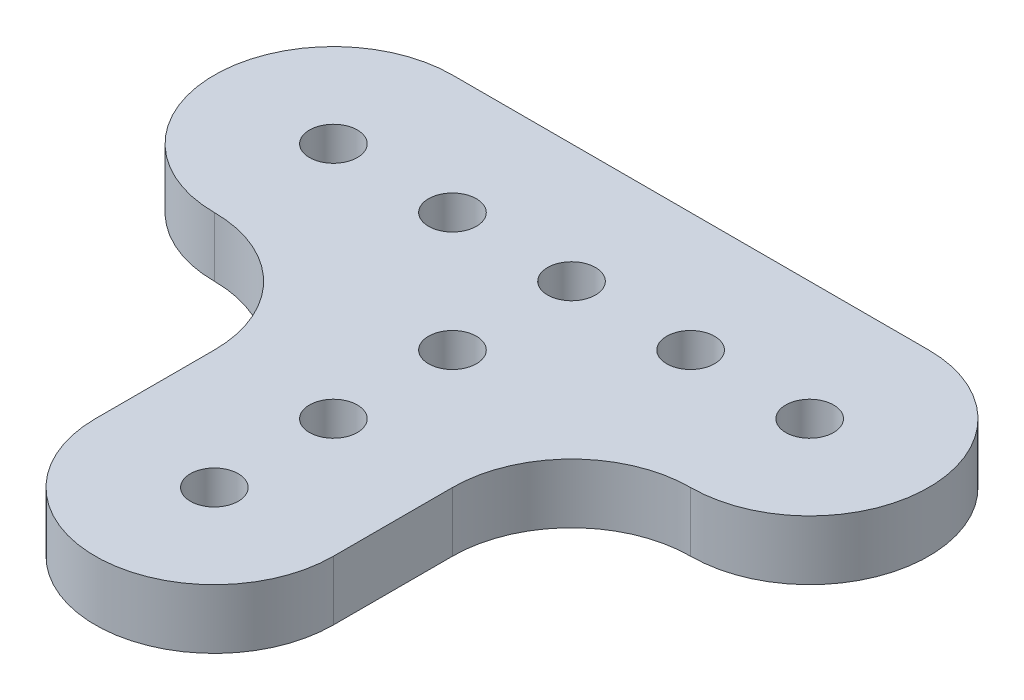
ISO-10303-21;
HEADER;
FILE_DESCRIPTION(('STEP AP214'),'2;1');
FILE_NAME('part.step','',(''),(''),'','','');
FILE_SCHEMA(('AUTOMOTIVE_DESIGN { 1 0 10303 214 1 1 1 1 }'));
ENDSEC;
DATA;
#1=APPLICATION_CONTEXT('core data for automotive mechanical design processes');
#2=APPLICATION_PROTOCOL_DEFINITION('international standard','automotive_design',2000,#1);
#3=PRODUCT_CONTEXT('',#1,'mechanical');
#4=PRODUCT('Part','Part','',(#3));
#5=PRODUCT_RELATED_PRODUCT_CATEGORY('part','',(#4));
#6=PRODUCT_DEFINITION_FORMATION('','',#4);
#7=PRODUCT_DEFINITION_CONTEXT('part definition',#1,'design');
#8=PRODUCT_DEFINITION('design','',#6,#7);
#9=PRODUCT_DEFINITION_SHAPE('','',#8);
#10=(LENGTH_UNIT() NAMED_UNIT(*) SI_UNIT(.MILLI.,.METRE.));
#11=(NAMED_UNIT(*) PLANE_ANGLE_UNIT() SI_UNIT($,.RADIAN.));
#12=(NAMED_UNIT(*) SI_UNIT($,.STERADIAN.) SOLID_ANGLE_UNIT());
#13=UNCERTAINTY_MEASURE_WITH_UNIT(LENGTH_MEASURE(1.E-05),#10,'distance_accuracy_value','');
#14=(GEOMETRIC_REPRESENTATION_CONTEXT(3) GLOBAL_UNCERTAINTY_ASSIGNED_CONTEXT((#13)) GLOBAL_UNIT_ASSIGNED_CONTEXT((#10,
#11,#12)) REPRESENTATION_CONTEXT('',''));
#15=CARTESIAN_POINT('',(0.,0.,0.));
#16=DIRECTION('',(0.,0.,1.));
#17=DIRECTION('',(1.,0.,0.));
#18=AXIS2_PLACEMENT_3D('',#15,#16,#17);
#19=CARTESIAN_POINT('',(50.8,3.175,0.));
#20=DIRECTION('',(0.,-1.,0.));
#21=DIRECTION('',(0.,0.,-1.));
#22=AXIS2_PLACEMENT_3D('',#19,#20,#21);
#23=CYLINDRICAL_SURFACE('',#22,12.7);
#24=CARTESIAN_POINT('',(50.8,-3.175,0.));
#25=DIRECTION('',(0.,1.,0.));
#26=DIRECTION('',(0.,0.,1.));
#27=AXIS2_PLACEMENT_3D('',#24,#25,#26);
#28=CIRCLE('',#27,12.7);
#29=CARTESIAN_POINT('',(50.8,-3.175,12.7));
#30=VERTEX_POINT('',#29);
#31=CARTESIAN_POINT('',(50.8,-3.175,-12.7));
#32=VERTEX_POINT('',#31);
#33=EDGE_CURVE('E115',#30,#32,#28,.T.);
#34=ORIENTED_EDGE('',*,*,#33,.T.);
#35=DIRECTION('',(0.,-1.,0.));
#36=VECTOR('',#35,1.);
#37=CARTESIAN_POINT('',(50.8,3.175,-12.7));
#38=LINE('',#37,#36);
#39=CARTESIAN_POINT('',(50.8,3.175,-12.7));
#40=VERTEX_POINT('',#39);
#41=EDGE_CURVE('E113',#40,#32,#38,.T.);
#42=ORIENTED_EDGE('',*,*,#41,.F.);
#43=CARTESIAN_POINT('',(50.8,3.175,0.));
#44=DIRECTION('',(0.,1.,0.));
#45=DIRECTION('',(0.,0.,1.));
#46=AXIS2_PLACEMENT_3D('',#43,#44,#45);
#47=CIRCLE('',#46,12.7);
#48=CARTESIAN_POINT('',(50.8,3.175,12.7));
#49=VERTEX_POINT('',#48);
#50=EDGE_CURVE('E98',#49,#40,#47,.T.);
#51=ORIENTED_EDGE('',*,*,#50,.F.);
#52=DIRECTION('',(0.,-1.,0.));
#53=VECTOR('',#52,1.);
#54=CARTESIAN_POINT('',(50.8,3.175,12.7));
#55=LINE('',#54,#53);
#56=EDGE_CURVE('E158',#49,#30,#55,.T.);
#57=ORIENTED_EDGE('',*,*,#56,.T.);
#58=EDGE_LOOP('',(#34,#42,#51,#57));
#59=FACE_BOUND('',#58,.T.);
#60=ADVANCED_FACE('F35',(#59),#23,.T.);
#61=CARTESIAN_POINT('',(0.,3.175,-12.7));
#62=DIRECTION('',(0.,0.,-1.));
#63=DIRECTION('',(-1.,0.,0.));
#64=AXIS2_PLACEMENT_3D('',#61,#62,#63);
#65=PLANE('',#64);
#66=DIRECTION('',(1.,0.,0.));
#67=VECTOR('',#66,1.);
#68=CARTESIAN_POINT('',(0.,-3.175,-12.7));
#69=LINE('',#68,#67);
#70=CARTESIAN_POINT('',(0.,-3.175,-12.7));
#71=VERTEX_POINT('',#70);
#72=EDGE_CURVE('E160',#71,#32,#69,.T.);
#73=ORIENTED_EDGE('',*,*,#72,.F.);
#74=DIRECTION('',(0.,-1.,0.));
#75=VECTOR('',#74,1.);
#76=CARTESIAN_POINT('',(0.,3.175,-12.7));
#77=LINE('',#76,#75);
#78=CARTESIAN_POINT('',(0.,3.175,-12.7));
#79=VERTEX_POINT('',#78);
#80=EDGE_CURVE('E120',#79,#71,#77,.T.);
#81=ORIENTED_EDGE('',*,*,#80,.F.);
#82=DIRECTION('',(1.,0.,0.));
#83=VECTOR('',#82,1.);
#84=CARTESIAN_POINT('',(0.,3.175,-12.7));
#85=LINE('',#84,#83);
#86=EDGE_CURVE('E103',#79,#40,#85,.T.);
#87=ORIENTED_EDGE('',*,*,#86,.T.);
#88=ORIENTED_EDGE('',*,*,#41,.T.);
#89=EDGE_LOOP('',(#73,#81,#87,#88));
#90=FACE_BOUND('',#89,.T.);
#91=ADVANCED_FACE('F122',(#90),#65,.T.);
#92=CARTESIAN_POINT('',(0.,3.175,0.));
#93=DIRECTION('',(0.,-1.,0.));
#94=DIRECTION('',(0.,0.,-1.));
#95=AXIS2_PLACEMENT_3D('',#92,#93,#94);
#96=CYLINDRICAL_SURFACE('',#95,12.7);
#97=CARTESIAN_POINT('',(0.,-3.175,0.));
#98=DIRECTION('',(0.,1.,0.));
#99=DIRECTION('',(0.,0.,1.));
#100=AXIS2_PLACEMENT_3D('',#97,#98,#99);
#101=CIRCLE('',#100,12.7);
#102=CARTESIAN_POINT('',(0.,-3.175,12.7));
#103=VERTEX_POINT('',#102);
#104=EDGE_CURVE('E162',#71,#103,#101,.T.);
#105=ORIENTED_EDGE('',*,*,#104,.T.);
#106=DIRECTION('',(0.,-1.,0.));
#107=VECTOR('',#106,1.);
#108=CARTESIAN_POINT('',(0.,3.175,12.7));
#109=LINE('',#108,#107);
#110=CARTESIAN_POINT('',(0.,3.175,12.7));
#111=VERTEX_POINT('',#110);
#112=EDGE_CURVE('E202',#111,#103,#109,.T.);
#113=ORIENTED_EDGE('',*,*,#112,.F.);
#114=CARTESIAN_POINT('',(0.,3.175,0.));
#115=DIRECTION('',(0.,1.,0.));
#116=DIRECTION('',(0.,0.,1.));
#117=AXIS2_PLACEMENT_3D('',#114,#115,#116);
#118=CIRCLE('',#117,12.7);
#119=EDGE_CURVE('E124',#79,#111,#118,.T.);
#120=ORIENTED_EDGE('',*,*,#119,.F.);
#121=ORIENTED_EDGE('',*,*,#80,.T.);
#122=EDGE_LOOP('',(#105,#113,#120,#121));
#123=FACE_BOUND('',#122,.T.);
#124=ADVANCED_FACE('F218',(#123),#96,.T.);
#125=CARTESIAN_POINT('',(12.7,3.175,0.));
#126=DIRECTION('',(-1.,0.,0.));
#127=DIRECTION('',(0.,0.,1.));
#128=AXIS2_PLACEMENT_3D('',#125,#126,#127);
#129=PLANE('',#128);
#130=DIRECTION('',(0.,0.,-1.));
#131=VECTOR('',#130,1.);
#132=CARTESIAN_POINT('',(12.7,3.175,0.));
#133=LINE('',#132,#131);
#134=CARTESIAN_POINT('',(12.7,3.175,38.1));
#135=VERTEX_POINT('',#134);
#136=CARTESIAN_POINT('',(12.7,3.175,25.4));
#137=VERTEX_POINT('',#136);
#138=EDGE_CURVE('E126',#135,#137,#133,.T.);
#139=ORIENTED_EDGE('',*,*,#138,.T.);
#140=DIRECTION('',(0.,-1.,0.));
#141=VECTOR('',#140,1.);
#142=CARTESIAN_POINT('',(12.7,3.175,25.4));
#143=LINE('',#142,#141);
#144=CARTESIAN_POINT('',(12.7,-3.175,25.4));
#145=VERTEX_POINT('',#144);
#146=EDGE_CURVE('E206',#137,#145,#143,.T.);
#147=ORIENTED_EDGE('',*,*,#146,.T.);
#148=DIRECTION('',(0.,0.,-1.));
#149=VECTOR('',#148,1.);
#150=CARTESIAN_POINT('',(12.7,-3.175,0.));
#151=LINE('',#150,#149);
#152=CARTESIAN_POINT('',(12.7,-3.175,38.1));
#153=VERTEX_POINT('',#152);
#154=EDGE_CURVE('E165',#153,#145,#151,.T.);
#155=ORIENTED_EDGE('',*,*,#154,.F.);
#156=DIRECTION('',(0.,-1.,0.));
#157=VECTOR('',#156,1.);
#158=CARTESIAN_POINT('',(12.7,3.175,38.1));
#159=LINE('',#158,#157);
#160=EDGE_CURVE('E200',#135,#153,#159,.T.);
#161=ORIENTED_EDGE('',*,*,#160,.F.);
#162=EDGE_LOOP('',(#139,#147,#155,#161));
#163=FACE_BOUND('',#162,.T.);
#164=ADVANCED_FACE('F220',(#163),#129,.T.);
#165=CARTESIAN_POINT('',(25.4000000000005,3.175,38.1));
#166=DIRECTION('',(0.,-1.,0.));
#167=DIRECTION('',(0.,0.,-1.));
#168=AXIS2_PLACEMENT_3D('',#165,#166,#167);
#169=CYLINDRICAL_SURFACE('',#168,12.7);
#170=CARTESIAN_POINT('',(25.4000000000005,-3.175,38.1));
#171=DIRECTION('',(0.,1.,0.));
#172=DIRECTION('',(0.,0.,1.));
#173=AXIS2_PLACEMENT_3D('',#170,#171,#172);
#174=CIRCLE('',#173,12.7);
#175=CARTESIAN_POINT('',(38.1,-3.175,38.1));
#176=VERTEX_POINT('',#175);
#177=EDGE_CURVE('E168',#153,#176,#174,.T.);
#178=ORIENTED_EDGE('',*,*,#177,.T.);
#179=DIRECTION('',(0.,-1.,0.));
#180=VECTOR('',#179,1.);
#181=CARTESIAN_POINT('',(38.1,3.175,38.1));
#182=LINE('',#181,#180);
#183=CARTESIAN_POINT('',(38.1,3.175,38.1));
#184=VERTEX_POINT('',#183);
#185=EDGE_CURVE('E197',#184,#176,#182,.T.);
#186=ORIENTED_EDGE('',*,*,#185,.F.);
#187=CARTESIAN_POINT('',(25.4000000000005,3.175,38.1));
#188=DIRECTION('',(0.,1.,0.));
#189=DIRECTION('',(0.,0.,1.));
#190=AXIS2_PLACEMENT_3D('',#187,#188,#189);
#191=CIRCLE('',#190,12.7);
#192=EDGE_CURVE('E130',#135,#184,#191,.T.);
#193=ORIENTED_EDGE('',*,*,#192,.F.);
#194=ORIENTED_EDGE('',*,*,#160,.T.);
#195=EDGE_LOOP('',(#178,#186,#193,#194));
#196=FACE_BOUND('',#195,.T.);
#197=ADVANCED_FACE('F225',(#196),#169,.T.);
#198=CARTESIAN_POINT('',(38.1,3.175,0.));
#199=DIRECTION('',(-1.,0.,0.));
#200=DIRECTION('',(0.,0.,1.));
#201=AXIS2_PLACEMENT_3D('',#198,#199,#200);
#202=PLANE('',#201);
#203=DIRECTION('',(0.,0.,-1.));
#204=VECTOR('',#203,1.);
#205=CARTESIAN_POINT('',(38.1,-3.175,0.));
#206=LINE('',#205,#204);
#207=CARTESIAN_POINT('',(38.1,-3.175,25.4));
#208=VERTEX_POINT('',#207);
#209=EDGE_CURVE('E170',#176,#208,#206,.T.);
#210=ORIENTED_EDGE('',*,*,#209,.T.);
#211=DIRECTION('',(0.,-1.,0.));
#212=VECTOR('',#211,1.);
#213=CARTESIAN_POINT('',(38.1,3.175,25.4));
#214=LINE('',#213,#212);
#215=CARTESIAN_POINT('',(38.1,3.175,25.4));
#216=VERTEX_POINT('',#215);
#217=EDGE_CURVE('E119',#208,#216,#214,.F.);
#218=ORIENTED_EDGE('',*,*,#217,.T.);
#219=DIRECTION('',(0.,0.,-1.));
#220=VECTOR('',#219,1.);
#221=CARTESIAN_POINT('',(38.1,3.175,0.));
#222=LINE('',#221,#220);
#223=EDGE_CURVE('E132',#184,#216,#222,.T.);
#224=ORIENTED_EDGE('',*,*,#223,.F.);
#225=ORIENTED_EDGE('',*,*,#185,.T.);
#226=EDGE_LOOP('',(#210,#218,#224,#225));
#227=FACE_BOUND('',#226,.T.);
#228=ADVANCED_FACE('F228',(#227),#202,.F.);
#229=CARTESIAN_POINT('',(25.4000000000003,3.175,25.4));
#230=DIRECTION('',(0.,-1.,0.));
#231=DIRECTION('',(0.,0.,-1.));
#232=AXIS2_PLACEMENT_3D('',#229,#230,#231);
#233=CYLINDRICAL_SURFACE('',#232,2.5527);
#234=CARTESIAN_POINT('',(25.4000000000003,3.175,25.4));
#235=DIRECTION('',(0.,1.,0.));
#236=DIRECTION('',(0.,0.,1.));
#237=AXIS2_PLACEMENT_3D('',#234,#235,#236);
#238=CIRCLE('',#237,2.5527);
#239=CARTESIAN_POINT('',(25.4000000000003,3.175,27.9527));
#240=VERTEX_POINT('',#239);
#241=EDGE_CURVE('E152',#240,#240,#238,.T.);
#242=ORIENTED_EDGE('',*,*,#241,.T.);
#243=EDGE_LOOP('',(#242));
#244=FACE_BOUND('',#243,.T.);
#245=CARTESIAN_POINT('',(25.4000000000003,-3.175,25.4));
#246=DIRECTION('',(0.,1.,0.));
#247=DIRECTION('',(0.,0.,1.));
#248=AXIS2_PLACEMENT_3D('',#245,#246,#247);
#249=CIRCLE('',#248,2.5527);
#250=CARTESIAN_POINT('',(25.4000000000003,-3.175,27.9527));
#251=VERTEX_POINT('',#250);
#252=EDGE_CURVE('E191',#251,#251,#249,.T.);
#253=ORIENTED_EDGE('',*,*,#252,.F.);
#254=EDGE_LOOP('',(#253));
#255=FACE_BOUND('',#254,.T.);
#256=ADVANCED_FACE('F253',(#244,#255),#233,.F.);
#257=CARTESIAN_POINT('',(50.8,3.175,0.));
#258=DIRECTION('',(0.,-1.,0.));
#259=DIRECTION('',(0.,0.,-1.));
#260=AXIS2_PLACEMENT_3D('',#257,#258,#259);
#261=CYLINDRICAL_SURFACE('',#260,2.5527);
#262=CARTESIAN_POINT('',(50.8,3.175,0.));
#263=DIRECTION('',(0.,1.,0.));
#264=DIRECTION('',(0.,0.,1.));
#265=AXIS2_PLACEMENT_3D('',#262,#263,#264);
#266=CIRCLE('',#265,2.5527);
#267=CARTESIAN_POINT('',(50.8,3.175,2.5527));
#268=VERTEX_POINT('',#267);
#269=EDGE_CURVE('E149',#268,#268,#266,.T.);
#270=ORIENTED_EDGE('',*,*,#269,.T.);
#271=EDGE_LOOP('',(#270));
#272=FACE_BOUND('',#271,.T.);
#273=CARTESIAN_POINT('',(50.8,-3.175,0.));
#274=DIRECTION('',(0.,1.,0.));
#275=DIRECTION('',(0.,0.,1.));
#276=AXIS2_PLACEMENT_3D('',#273,#274,#275);
#277=CIRCLE('',#276,2.5527);
#278=CARTESIAN_POINT('',(50.8,-3.175,2.5527));
#279=VERTEX_POINT('',#278);
#280=EDGE_CURVE('E188',#279,#279,#277,.T.);
#281=ORIENTED_EDGE('',*,*,#280,.F.);
#282=EDGE_LOOP('',(#281));
#283=FACE_BOUND('',#282,.T.);
#284=ADVANCED_FACE('F274',(#272,#283),#261,.F.);
#285=CARTESIAN_POINT('',(25.4,3.175,0.));
#286=DIRECTION('',(0.,-1.,0.));
#287=DIRECTION('',(0.,0.,-1.));
#288=AXIS2_PLACEMENT_3D('',#285,#286,#287);
#289=CYLINDRICAL_SURFACE('',#288,2.5527);
#290=CARTESIAN_POINT('',(25.4,3.175,0.));
#291=DIRECTION('',(0.,1.,0.));
#292=DIRECTION('',(0.,0.,1.));
#293=AXIS2_PLACEMENT_3D('',#290,#291,#292);
#294=CIRCLE('',#293,2.5527);
#295=CARTESIAN_POINT('',(25.4,3.175,2.5527));
#296=VERTEX_POINT('',#295);
#297=EDGE_CURVE('E146',#296,#296,#294,.T.);
#298=ORIENTED_EDGE('',*,*,#297,.T.);
#299=EDGE_LOOP('',(#298));
#300=FACE_BOUND('',#299,.T.);
#301=CARTESIAN_POINT('',(25.4,-3.175,0.));
#302=DIRECTION('',(0.,1.,0.));
#303=DIRECTION('',(0.,0.,1.));
#304=AXIS2_PLACEMENT_3D('',#301,#302,#303);
#305=CIRCLE('',#304,2.5527);
#306=CARTESIAN_POINT('',(25.4,-3.175,2.5527));
#307=VERTEX_POINT('',#306);
#308=EDGE_CURVE('E185',#307,#307,#305,.T.);
#309=ORIENTED_EDGE('',*,*,#308,.F.);
#310=EDGE_LOOP('',(#309));
#311=FACE_BOUND('',#310,.T.);
#312=ADVANCED_FACE('F270',(#300,#311),#289,.F.);
#313=CARTESIAN_POINT('',(0.,3.175,0.));
#314=DIRECTION('',(0.,-1.,0.));
#315=DIRECTION('',(0.,0.,-1.));
#316=AXIS2_PLACEMENT_3D('',#313,#314,#315);
#317=CYLINDRICAL_SURFACE('',#316,2.5527);
#318=CARTESIAN_POINT('',(0.,3.175,0.));
#319=DIRECTION('',(0.,1.,0.));
#320=DIRECTION('',(0.,0.,1.));
#321=AXIS2_PLACEMENT_3D('',#318,#319,#320);
#322=CIRCLE('',#321,2.5527);
#323=CARTESIAN_POINT('',(0.,3.175,2.5527));
#324=VERTEX_POINT('',#323);
#325=EDGE_CURVE('E143',#324,#324,#322,.T.);
#326=ORIENTED_EDGE('',*,*,#325,.T.);
#327=EDGE_LOOP('',(#326));
#328=FACE_BOUND('',#327,.T.);
#329=CARTESIAN_POINT('',(0.,-3.175,0.));
#330=DIRECTION('',(0.,1.,0.));
#331=DIRECTION('',(0.,0.,1.));
#332=AXIS2_PLACEMENT_3D('',#329,#330,#331);
#333=CIRCLE('',#332,2.5527);
#334=CARTESIAN_POINT('',(0.,-3.175,2.5527));
#335=VERTEX_POINT('',#334);
#336=EDGE_CURVE('E182',#335,#335,#333,.T.);
#337=ORIENTED_EDGE('',*,*,#336,.F.);
#338=EDGE_LOOP('',(#337));
#339=FACE_BOUND('',#338,.T.);
#340=ADVANCED_FACE('F266',(#328,#339),#317,.F.);
#341=CARTESIAN_POINT('',(38.1,3.175,0.));
#342=DIRECTION('',(0.,-1.,0.));
#343=DIRECTION('',(0.,0.,-1.));
#344=AXIS2_PLACEMENT_3D('',#341,#342,#343);
#345=CYLINDRICAL_SURFACE('',#344,2.5527);
#346=CARTESIAN_POINT('',(38.1,3.175,0.));
#347=DIRECTION('',(0.,1.,0.));
#348=DIRECTION('',(0.,0.,1.));
#349=AXIS2_PLACEMENT_3D('',#346,#347,#348);
#350=CIRCLE('',#349,2.5527);
#351=CARTESIAN_POINT('',(38.1,3.175,2.5527));
#352=VERTEX_POINT('',#351);
#353=EDGE_CURVE('E140',#352,#352,#350,.T.);
#354=ORIENTED_EDGE('',*,*,#353,.T.);
#355=EDGE_LOOP('',(#354));
#356=FACE_BOUND('',#355,.T.);
#357=CARTESIAN_POINT('',(38.1,-3.175,0.));
#358=DIRECTION('',(0.,1.,0.));
#359=DIRECTION('',(0.,0.,1.));
#360=AXIS2_PLACEMENT_3D('',#357,#358,#359);
#361=CIRCLE('',#360,2.5527);
#362=CARTESIAN_POINT('',(38.1,-3.175,2.5527));
#363=VERTEX_POINT('',#362);
#364=EDGE_CURVE('E179',#363,#363,#361,.T.);
#365=ORIENTED_EDGE('',*,*,#364,.F.);
#366=EDGE_LOOP('',(#365));
#367=FACE_BOUND('',#366,.T.);
#368=ADVANCED_FACE('F262',(#356,#367),#345,.F.);
#369=CARTESIAN_POINT('',(12.7,3.175,0.));
#370=DIRECTION('',(0.,-1.,0.));
#371=DIRECTION('',(0.,0.,-1.));
#372=AXIS2_PLACEMENT_3D('',#369,#370,#371);
#373=CYLINDRICAL_SURFACE('',#372,2.5527);
#374=CARTESIAN_POINT('',(12.7,3.175,0.));
#375=DIRECTION('',(0.,1.,0.));
#376=DIRECTION('',(0.,0.,1.));
#377=AXIS2_PLACEMENT_3D('',#374,#375,#376);
#378=CIRCLE('',#377,2.5527);
#379=CARTESIAN_POINT('',(12.7,3.175,2.5527));
#380=VERTEX_POINT('',#379);
#381=EDGE_CURVE('E137',#380,#380,#378,.T.);
#382=ORIENTED_EDGE('',*,*,#381,.T.);
#383=EDGE_LOOP('',(#382));
#384=FACE_BOUND('',#383,.T.);
#385=CARTESIAN_POINT('',(12.7,-3.175,0.));
#386=DIRECTION('',(0.,1.,0.));
#387=DIRECTION('',(0.,0.,1.));
#388=AXIS2_PLACEMENT_3D('',#385,#386,#387);
#389=CIRCLE('',#388,2.5527);
#390=CARTESIAN_POINT('',(12.7,-3.175,2.5527));
#391=VERTEX_POINT('',#390);
#392=EDGE_CURVE('E176',#391,#391,#389,.T.);
#393=ORIENTED_EDGE('',*,*,#392,.F.);
#394=EDGE_LOOP('',(#393));
#395=FACE_BOUND('',#394,.T.);
#396=ADVANCED_FACE('F258',(#384,#395),#373,.F.);
#397=CARTESIAN_POINT('',(25.4000000000001,3.175,12.7));
#398=DIRECTION('',(0.,-1.,0.));
#399=DIRECTION('',(0.,0.,-1.));
#400=AXIS2_PLACEMENT_3D('',#397,#398,#399);
#401=CYLINDRICAL_SURFACE('',#400,2.5527);
#402=CARTESIAN_POINT('',(25.4000000000001,3.175,12.7));
#403=DIRECTION('',(0.,1.,0.));
#404=DIRECTION('',(0.,0.,1.));
#405=AXIS2_PLACEMENT_3D('',#402,#403,#404);
#406=CIRCLE('',#405,2.5527);
#407=CARTESIAN_POINT('',(25.4000000000001,3.175,15.2527));
#408=VERTEX_POINT('',#407);
#409=EDGE_CURVE('E134',#408,#408,#406,.T.);
#410=ORIENTED_EDGE('',*,*,#409,.T.);
#411=EDGE_LOOP('',(#410));
#412=FACE_BOUND('',#411,.T.);
#413=CARTESIAN_POINT('',(25.4000000000001,-3.175,12.7));
#414=DIRECTION('',(0.,1.,0.));
#415=DIRECTION('',(0.,0.,1.));
#416=AXIS2_PLACEMENT_3D('',#413,#414,#415);
#417=CIRCLE('',#416,2.5527);
#418=CARTESIAN_POINT('',(25.4000000000001,-3.175,15.2527));
#419=VERTEX_POINT('',#418);
#420=EDGE_CURVE('E173',#419,#419,#417,.T.);
#421=ORIENTED_EDGE('',*,*,#420,.F.);
#422=EDGE_LOOP('',(#421));
#423=FACE_BOUND('',#422,.T.);
#424=ADVANCED_FACE('F254',(#412,#423),#401,.F.);
#425=CARTESIAN_POINT('',(25.4000000000004,3.175,38.1));
#426=DIRECTION('',(0.,-1.,0.));
#427=DIRECTION('',(0.,0.,-1.));
#428=AXIS2_PLACEMENT_3D('',#425,#426,#427);
#429=CYLINDRICAL_SURFACE('',#428,2.5527);
#430=CARTESIAN_POINT('',(25.4000000000004,3.175,38.1));
#431=DIRECTION('',(0.,1.,0.));
#432=DIRECTION('',(0.,0.,1.));
#433=AXIS2_PLACEMENT_3D('',#430,#431,#432);
#434=CIRCLE('',#433,2.5527);
#435=CARTESIAN_POINT('',(25.4000000000004,3.175,40.6527));
#436=VERTEX_POINT('',#435);
#437=EDGE_CURVE('E155',#436,#436,#434,.T.);
#438=ORIENTED_EDGE('',*,*,#437,.T.);
#439=EDGE_LOOP('',(#438));
#440=FACE_BOUND('',#439,.T.);
#441=CARTESIAN_POINT('',(25.4000000000004,-3.175,38.1));
#442=DIRECTION('',(0.,1.,0.));
#443=DIRECTION('',(0.,0.,1.));
#444=AXIS2_PLACEMENT_3D('',#441,#442,#443);
#445=CIRCLE('',#444,2.5527);
#446=CARTESIAN_POINT('',(25.4000000000004,-3.175,40.6527));
#447=VERTEX_POINT('',#446);
#448=EDGE_CURVE('E110',#447,#447,#445,.T.);
#449=ORIENTED_EDGE('',*,*,#448,.F.);
#450=EDGE_LOOP('',(#449));
#451=FACE_BOUND('',#450,.T.);
#452=ADVANCED_FACE('F257',(#440,#451),#429,.F.);
#453=CARTESIAN_POINT('',(0.,3.175,0.));
#454=DIRECTION('',(0.,1.,0.));
#455=DIRECTION('',(0.,0.,1.));
#456=AXIS2_PLACEMENT_3D('',#453,#454,#455);
#457=PLANE('',#456);
#458=ORIENTED_EDGE('',*,*,#50,.T.);
#459=ORIENTED_EDGE('',*,*,#86,.F.);
#460=ORIENTED_EDGE('',*,*,#119,.T.);
#461=CARTESIAN_POINT('',(0.,3.175,25.4));
#462=DIRECTION('',(0.,1.,0.));
#463=DIRECTION('',(0.,0.,1.));
#464=AXIS2_PLACEMENT_3D('',#461,#462,#463);
#465=CIRCLE('',#464,12.7);
#466=EDGE_CURVE('E11',#111,#137,#465,.F.);
#467=ORIENTED_EDGE('',*,*,#466,.T.);
#468=ORIENTED_EDGE('',*,*,#138,.F.);
#469=ORIENTED_EDGE('',*,*,#192,.T.);
#470=ORIENTED_EDGE('',*,*,#223,.T.);
#471=CARTESIAN_POINT('',(50.8,3.175,25.4));
#472=DIRECTION('',(0.,1.,0.));
#473=DIRECTION('',(0.,0.,1.));
#474=AXIS2_PLACEMENT_3D('',#471,#472,#473);
#475=CIRCLE('',#474,12.7);
#476=EDGE_CURVE('E106',#216,#49,#475,.F.);
#477=ORIENTED_EDGE('',*,*,#476,.T.);
#478=EDGE_LOOP('',(#458,#459,#460,#467,#468,#469,#470,#477));
#479=FACE_BOUND('',#478,.T.);
#480=ORIENTED_EDGE('',*,*,#409,.F.);
#481=EDGE_LOOP('',(#480));
#482=FACE_BOUND('',#481,.T.);
#483=ORIENTED_EDGE('',*,*,#381,.F.);
#484=EDGE_LOOP('',(#483));
#485=FACE_BOUND('',#484,.T.);
#486=ORIENTED_EDGE('',*,*,#353,.F.);
#487=EDGE_LOOP('',(#486));
#488=FACE_BOUND('',#487,.T.);
#489=ORIENTED_EDGE('',*,*,#325,.F.);
#490=EDGE_LOOP('',(#489));
#491=FACE_BOUND('',#490,.T.);
#492=ORIENTED_EDGE('',*,*,#297,.F.);
#493=EDGE_LOOP('',(#492));
#494=FACE_BOUND('',#493,.T.);
#495=ORIENTED_EDGE('',*,*,#269,.F.);
#496=EDGE_LOOP('',(#495));
#497=FACE_BOUND('',#496,.T.);
#498=ORIENTED_EDGE('',*,*,#241,.F.);
#499=EDGE_LOOP('',(#498));
#500=FACE_BOUND('',#499,.T.);
#501=ORIENTED_EDGE('',*,*,#437,.F.);
#502=EDGE_LOOP('',(#501));
#503=FACE_BOUND('',#502,.T.);
#504=ADVANCED_FACE('F100',(#479,#482,#485,#488,#491,#494,#497,#500,#503),#457,.T.);
#505=CARTESIAN_POINT('',(0.,-3.175,0.));
#506=DIRECTION('',(0.,1.,0.));
#507=DIRECTION('',(0.,0.,1.));
#508=AXIS2_PLACEMENT_3D('',#505,#506,#507);
#509=PLANE('',#508);
#510=ORIENTED_EDGE('',*,*,#33,.F.);
#511=CARTESIAN_POINT('',(50.8,-3.175,25.4));
#512=DIRECTION('',(0.,1.,0.));
#513=DIRECTION('',(0.,0.,1.));
#514=AXIS2_PLACEMENT_3D('',#511,#512,#513);
#515=CIRCLE('',#514,12.7);
#516=EDGE_CURVE('E208',#30,#208,#515,.T.);
#517=ORIENTED_EDGE('',*,*,#516,.T.);
#518=ORIENTED_EDGE('',*,*,#209,.F.);
#519=ORIENTED_EDGE('',*,*,#177,.F.);
#520=ORIENTED_EDGE('',*,*,#154,.T.);
#521=CARTESIAN_POINT('',(0.,-3.175,25.4));
#522=DIRECTION('',(0.,1.,0.));
#523=DIRECTION('',(0.,0.,1.));
#524=AXIS2_PLACEMENT_3D('',#521,#522,#523);
#525=CIRCLE('',#524,12.7);
#526=EDGE_CURVE('E43',#145,#103,#525,.T.);
#527=ORIENTED_EDGE('',*,*,#526,.T.);
#528=ORIENTED_EDGE('',*,*,#104,.F.);
#529=ORIENTED_EDGE('',*,*,#72,.T.);
#530=EDGE_LOOP('',(#510,#517,#518,#519,#520,#527,#528,#529));
#531=FACE_BOUND('',#530,.T.);
#532=ORIENTED_EDGE('',*,*,#420,.T.);
#533=EDGE_LOOP('',(#532));
#534=FACE_BOUND('',#533,.T.);
#535=ORIENTED_EDGE('',*,*,#392,.T.);
#536=EDGE_LOOP('',(#535));
#537=FACE_BOUND('',#536,.T.);
#538=ORIENTED_EDGE('',*,*,#364,.T.);
#539=EDGE_LOOP('',(#538));
#540=FACE_BOUND('',#539,.T.);
#541=ORIENTED_EDGE('',*,*,#336,.T.);
#542=EDGE_LOOP('',(#541));
#543=FACE_BOUND('',#542,.T.);
#544=ORIENTED_EDGE('',*,*,#308,.T.);
#545=EDGE_LOOP('',(#544));
#546=FACE_BOUND('',#545,.T.);
#547=ORIENTED_EDGE('',*,*,#280,.T.);
#548=EDGE_LOOP('',(#547));
#549=FACE_BOUND('',#548,.T.);
#550=ORIENTED_EDGE('',*,*,#252,.T.);
#551=EDGE_LOOP('',(#550));
#552=FACE_BOUND('',#551,.T.);
#553=ORIENTED_EDGE('',*,*,#448,.T.);
#554=EDGE_LOOP('',(#553));
#555=FACE_BOUND('',#554,.T.);
#556=ADVANCED_FACE('F212',(#531,#534,#537,#540,#543,#546,#549,#552,#555),#509,.F.);
#557=CARTESIAN_POINT('',(50.8,3.175,25.4));
#558=DIRECTION('',(0.,1.,0.));
#559=DIRECTION('',(0.,0.,1.));
#560=AXIS2_PLACEMENT_3D('',#557,#558,#559);
#561=CYLINDRICAL_SURFACE('',#560,12.7);
#562=ORIENTED_EDGE('',*,*,#476,.F.);
#563=ORIENTED_EDGE('',*,*,#217,.F.);
#564=ORIENTED_EDGE('',*,*,#516,.F.);
#565=ORIENTED_EDGE('',*,*,#56,.F.);
#566=EDGE_LOOP('',(#562,#563,#564,#565));
#567=FACE_BOUND('',#566,.T.);
#568=ADVANCED_FACE('F231',(#567),#561,.F.);
#569=CARTESIAN_POINT('',(0.,3.175,25.4));
#570=DIRECTION('',(0.,-1.,0.));
#571=DIRECTION('',(0.,0.,-1.));
#572=AXIS2_PLACEMENT_3D('',#569,#570,#571);
#573=CYLINDRICAL_SURFACE('',#572,12.7);
#574=ORIENTED_EDGE('',*,*,#466,.F.);
#575=ORIENTED_EDGE('',*,*,#112,.T.);
#576=ORIENTED_EDGE('',*,*,#526,.F.);
#577=ORIENTED_EDGE('',*,*,#146,.F.);
#578=EDGE_LOOP('',(#574,#575,#576,#577));
#579=FACE_BOUND('',#578,.T.);
#580=ADVANCED_FACE('F37',(#579),#573,.F.);
#581=CLOSED_SHELL('',(#60,#91,#124,#164,#197,#228,#256,#284,#312,#340,#368,#396,#424,#452,#504,
#556,#568,#580));
#582=MANIFOLD_SOLID_BREP('B2',#581);
#583=ADVANCED_BREP_SHAPE_REPRESENTATION('',(#18,#582),#14);
#584=SHAPE_DEFINITION_REPRESENTATION(#9,#583);
ENDSEC;
END-ISO-10303-21;
